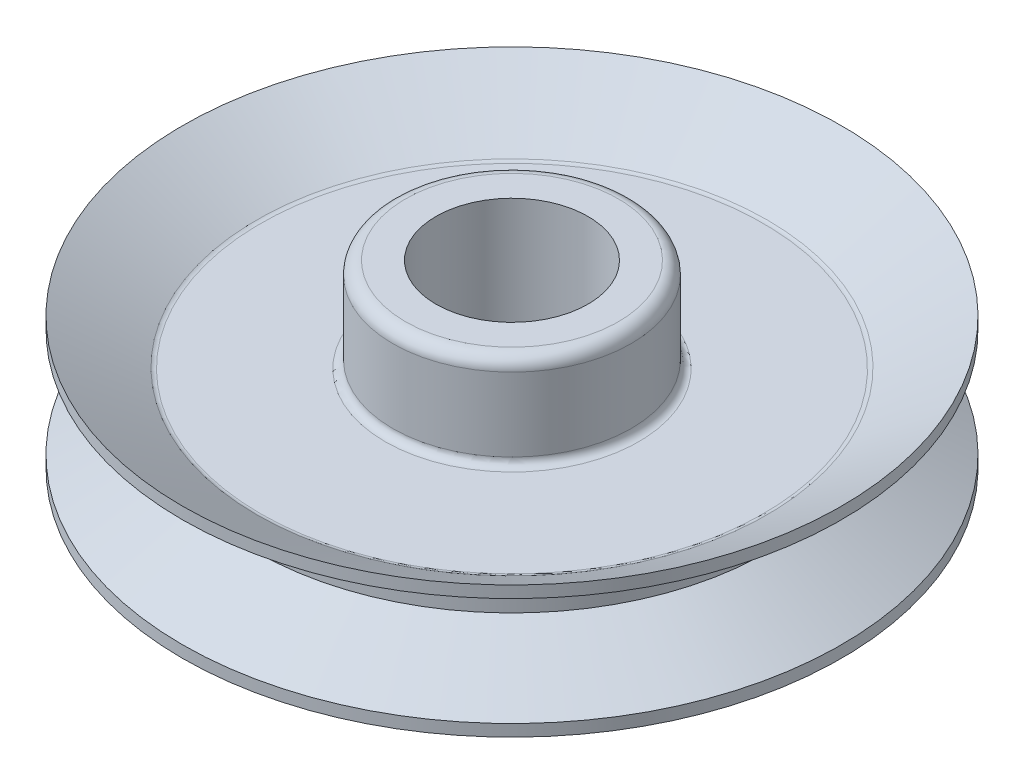
ISO-10303-21;
HEADER;
FILE_DESCRIPTION(('STEP AP214'),'2;1');
FILE_NAME('part.step','',(''),(''),'','','');
FILE_SCHEMA(('AUTOMOTIVE_DESIGN { 1 0 10303 214 1 1 1 1 }'));
ENDSEC;
DATA;
#1=APPLICATION_CONTEXT('core data for automotive mechanical design processes');
#2=APPLICATION_PROTOCOL_DEFINITION('international standard','automotive_design',2000,#1);
#3=PRODUCT_CONTEXT('',#1,'mechanical');
#4=PRODUCT('Part','Part','',(#3));
#5=PRODUCT_RELATED_PRODUCT_CATEGORY('part','',(#4));
#6=PRODUCT_DEFINITION_FORMATION('','',#4);
#7=PRODUCT_DEFINITION_CONTEXT('part definition',#1,'design');
#8=PRODUCT_DEFINITION('design','',#6,#7);
#9=PRODUCT_DEFINITION_SHAPE('','',#8);
#10=(LENGTH_UNIT() NAMED_UNIT(*) SI_UNIT(.MILLI.,.METRE.));
#11=(NAMED_UNIT(*) PLANE_ANGLE_UNIT() SI_UNIT($,.RADIAN.));
#12=(NAMED_UNIT(*) SI_UNIT($,.STERADIAN.) SOLID_ANGLE_UNIT());
#13=UNCERTAINTY_MEASURE_WITH_UNIT(LENGTH_MEASURE(1.E-05),#10,'distance_accuracy_value','');
#14=(GEOMETRIC_REPRESENTATION_CONTEXT(3) GLOBAL_UNCERTAINTY_ASSIGNED_CONTEXT((#13)) GLOBAL_UNIT_ASSIGNED_CONTEXT((#10,
#11,#12)) REPRESENTATION_CONTEXT('',''));
#15=CARTESIAN_POINT('',(0.,0.,0.));
#16=DIRECTION('',(0.,0.,1.));
#17=DIRECTION('',(1.,0.,0.));
#18=AXIS2_PLACEMENT_3D('',#15,#16,#17);
#19=CARTESIAN_POINT('',(0.,0.,0.));
#20=DIRECTION('',(0.,1.,0.));
#21=DIRECTION('',(0.,0.,1.));
#22=AXIS2_PLACEMENT_3D('',#19,#20,#21);
#23=CYLINDRICAL_SURFACE('',#22,13.);
#24=CARTESIAN_POINT('',(0.,2.38352384841238,0.));
#25=DIRECTION('',(0.,1.,0.));
#26=DIRECTION('',(0.,0.,1.));
#27=AXIS2_PLACEMENT_3D('',#24,#25,#26);
#28=CIRCLE('',#27,13.);
#29=CARTESIAN_POINT('',(0.,2.38352384841237,13.));
#30=VERTEX_POINT('',#29);
#31=EDGE_CURVE('E77',#30,#30,#28,.T.);
#32=ORIENTED_EDGE('',*,*,#31,.T.);
#33=EDGE_LOOP('',(#32));
#34=FACE_BOUND('',#33,.T.);
#35=CARTESIAN_POINT('',(0.,2.85,0.));
#36=DIRECTION('',(0.,1.,0.));
#37=DIRECTION('',(0.,0.,1.));
#38=AXIS2_PLACEMENT_3D('',#35,#36,#37);
#39=CIRCLE('',#38,13.);
#40=CARTESIAN_POINT('',(0.,2.85,13.));
#41=VERTEX_POINT('',#40);
#42=EDGE_CURVE('E92',#41,#41,#39,.T.);
#43=ORIENTED_EDGE('',*,*,#42,.F.);
#44=EDGE_LOOP('',(#43));
#45=FACE_BOUND('',#44,.T.);
#46=ADVANCED_FACE('F33',(#34,#45),#23,.T.);
#47=CARTESIAN_POINT('',(0.,2.38352384841238,0.));
#48=DIRECTION('',(0.,1.,0.));
#49=DIRECTION('',(0.,0.,1.));
#50=AXIS2_PLACEMENT_3D('',#47,#48,#49);
#51=CONICAL_SURFACE('',#50,13.,1.03037682652431);
#52=CARTESIAN_POINT('',(0.,0.650000000000002,0.));
#53=DIRECTION('',(0.,1.,0.));
#54=DIRECTION('',(0.,0.,1.));
#55=AXIS2_PLACEMENT_3D('',#52,#53,#54);
#56=CIRCLE('',#55,10.1107935859794);
#57=CARTESIAN_POINT('',(0.,0.650000000000001,10.1107935859794));
#58=VERTEX_POINT('',#57);
#59=EDGE_CURVE('E80',#58,#58,#56,.T.);
#60=ORIENTED_EDGE('',*,*,#59,.T.);
#61=EDGE_LOOP('',(#60));
#62=FACE_BOUND('',#61,.T.);
#63=ORIENTED_EDGE('',*,*,#31,.F.);
#64=EDGE_LOOP('',(#63));
#65=FACE_BOUND('',#64,.T.);
#66=ADVANCED_FACE('F119',(#62,#65),#51,.T.);
#67=CARTESIAN_POINT('',(0.,0.,0.));
#68=DIRECTION('',(0.,1.,0.));
#69=DIRECTION('',(0.,0.,1.));
#70=AXIS2_PLACEMENT_3D('',#67,#68,#69);
#71=CYLINDRICAL_SURFACE('',#70,10.1107935859794);
#72=CARTESIAN_POINT('',(0.,-0.150000000000004,0.));
#73=DIRECTION('',(0.,1.,0.));
#74=DIRECTION('',(0.,0.,1.));
#75=AXIS2_PLACEMENT_3D('',#72,#73,#74);
#76=CIRCLE('',#75,10.1107935859794);
#77=CARTESIAN_POINT('',(0.,-0.150000000000005,10.1107935859794));
#78=VERTEX_POINT('',#77);
#79=EDGE_CURVE('E83',#78,#78,#76,.T.);
#80=ORIENTED_EDGE('',*,*,#79,.T.);
#81=EDGE_LOOP('',(#80));
#82=FACE_BOUND('',#81,.T.);
#83=ORIENTED_EDGE('',*,*,#59,.F.);
#84=EDGE_LOOP('',(#83));
#85=FACE_BOUND('',#84,.T.);
#86=ADVANCED_FACE('F125',(#82,#85),#71,.T.);
#87=CARTESIAN_POINT('',(0.,-0.150000000000004,0.));
#88=DIRECTION('',(0.,-1.,0.));
#89=DIRECTION('',(0.,0.,-1.));
#90=AXIS2_PLACEMENT_3D('',#87,#88,#89);
#91=CONICAL_SURFACE('',#90,10.1107935859794,1.03037682652431);
#92=CARTESIAN_POINT('',(0.,-1.88352384841238,0.));
#93=DIRECTION('',(0.,1.,0.));
#94=DIRECTION('',(0.,0.,1.));
#95=AXIS2_PLACEMENT_3D('',#92,#93,#94);
#96=CIRCLE('',#95,13.);
#97=CARTESIAN_POINT('',(0.,-1.88352384841238,13.));
#98=VERTEX_POINT('',#97);
#99=EDGE_CURVE('E86',#98,#98,#96,.T.);
#100=ORIENTED_EDGE('',*,*,#99,.T.);
#101=EDGE_LOOP('',(#100));
#102=FACE_BOUND('',#101,.T.);
#103=ORIENTED_EDGE('',*,*,#79,.F.);
#104=EDGE_LOOP('',(#103));
#105=FACE_BOUND('',#104,.T.);
#106=ADVANCED_FACE('F176',(#102,#105),#91,.T.);
#107=CARTESIAN_POINT('',(0.,0.,0.));
#108=DIRECTION('',(0.,1.,0.));
#109=DIRECTION('',(0.,0.,1.));
#110=AXIS2_PLACEMENT_3D('',#107,#108,#109);
#111=CYLINDRICAL_SURFACE('',#110,13.);
#112=CARTESIAN_POINT('',(0.,-2.35,0.));
#113=DIRECTION('',(0.,1.,0.));
#114=DIRECTION('',(0.,0.,1.));
#115=AXIS2_PLACEMENT_3D('',#112,#113,#114);
#116=CIRCLE('',#115,13.);
#117=CARTESIAN_POINT('',(0.,-2.35,13.));
#118=VERTEX_POINT('',#117);
#119=EDGE_CURVE('E89',#118,#118,#116,.T.);
#120=ORIENTED_EDGE('',*,*,#119,.T.);
#121=EDGE_LOOP('',(#120));
#122=FACE_BOUND('',#121,.T.);
#123=ORIENTED_EDGE('',*,*,#99,.F.);
#124=EDGE_LOOP('',(#123));
#125=FACE_BOUND('',#124,.T.);
#126=ADVANCED_FACE('F169',(#122,#125),#111,.T.);
#127=CARTESIAN_POINT('',(0.,-2.35,0.));
#128=DIRECTION('',(0.,-1.,0.));
#129=DIRECTION('',(0.,0.,-1.));
#130=AXIS2_PLACEMENT_3D('',#127,#128,#129);
#131=CONICAL_SURFACE('',#130,13.,1.03037682652431);
#132=CARTESIAN_POINT('',(0.,-0.592752122286239,0.));
#133=DIRECTION('',(0.,-1.,0.));
#134=DIRECTION('',(0.,0.,-1.));
#135=AXIS2_PLACEMENT_3D('',#132,#133,#134);
#136=CIRCLE('',#135,10.0712535371437);
#137=CARTESIAN_POINT('',(0.,-0.592752122286237,-10.0712535371437));
#138=VERTEX_POINT('',#137);
#139=EDGE_CURVE('E62',#138,#138,#136,.F.);
#140=ORIENTED_EDGE('',*,*,#139,.T.);
#141=EDGE_LOOP('',(#140));
#142=FACE_BOUND('',#141,.T.);
#143=ORIENTED_EDGE('',*,*,#119,.F.);
#144=EDGE_LOOP('',(#143));
#145=FACE_BOUND('',#144,.T.);
#146=ADVANCED_FACE('F159',(#142,#145),#131,.F.);
#147=CARTESIAN_POINT('',(0.,-0.550000000000003,0.));
#148=DIRECTION('',(0.,-1.,0.));
#149=DIRECTION('',(0.,0.,-1.));
#150=AXIS2_PLACEMENT_3D('',#147,#148,#149);
#151=PLANE('',#150);
#152=CARTESIAN_POINT('',(0.,-0.550000000000003,0.));
#153=DIRECTION('',(0.,-1.,0.));
#154=DIRECTION('',(0.,0.,-1.));
#155=AXIS2_PLACEMENT_3D('',#152,#153,#154);
#156=CIRCLE('',#155,9.91690481051547);
#157=CARTESIAN_POINT('',(0.,-0.550000000000002,-9.91690481051547));
#158=VERTEX_POINT('',#157);
#159=EDGE_CURVE('E56',#158,#158,#156,.T.);
#160=ORIENTED_EDGE('',*,*,#159,.T.);
#161=EDGE_LOOP('',(#160));
#162=FACE_BOUND('',#161,.T.);
#163=CARTESIAN_POINT('',(0.,-0.550000000000003,0.));
#164=DIRECTION('',(0.,-1.,0.));
#165=DIRECTION('',(0.,0.,-1.));
#166=AXIS2_PLACEMENT_3D('',#163,#164,#165);
#167=CIRCLE('',#166,5.);
#168=CARTESIAN_POINT('',(0.,-0.550000000000003,-5.));
#169=VERTEX_POINT('',#168);
#170=EDGE_CURVE('E59',#169,#169,#167,.F.);
#171=ORIENTED_EDGE('',*,*,#170,.T.);
#172=EDGE_LOOP('',(#171));
#173=FACE_BOUND('',#172,.T.);
#174=ADVANCED_FACE('F156',(#162,#173),#151,.T.);
#175=CARTESIAN_POINT('',(0.,1.05,0.));
#176=DIRECTION('',(0.,1.,0.));
#177=DIRECTION('',(0.,0.,1.));
#178=AXIS2_PLACEMENT_3D('',#175,#176,#177);
#179=PLANE('',#178);
#180=CARTESIAN_POINT('',(0.,1.05,0.));
#181=DIRECTION('',(0.,1.,0.));
#182=DIRECTION('',(0.,0.,1.));
#183=AXIS2_PLACEMENT_3D('',#180,#181,#182);
#184=CIRCLE('',#183,9.91690481051547);
#185=CARTESIAN_POINT('',(0.,1.05,9.91690481051547));
#186=VERTEX_POINT('',#185);
#187=EDGE_CURVE('E48',#186,#186,#184,.T.);
#188=ORIENTED_EDGE('',*,*,#187,.T.);
#189=EDGE_LOOP('',(#188));
#190=FACE_BOUND('',#189,.T.);
#191=CARTESIAN_POINT('',(0.,1.05,0.));
#192=DIRECTION('',(0.,1.,0.));
#193=DIRECTION('',(0.,0.,1.));
#194=AXIS2_PLACEMENT_3D('',#191,#192,#193);
#195=CIRCLE('',#194,5.);
#196=CARTESIAN_POINT('',(0.,1.05,5.));
#197=VERTEX_POINT('',#196);
#198=EDGE_CURVE('E53',#197,#197,#195,.F.);
#199=ORIENTED_EDGE('',*,*,#198,.T.);
#200=EDGE_LOOP('',(#199));
#201=FACE_BOUND('',#200,.T.);
#202=ADVANCED_FACE('F158',(#190,#201),#179,.T.);
#203=CARTESIAN_POINT('',(0.,1.05,0.));
#204=DIRECTION('',(0.,1.,0.));
#205=DIRECTION('',(0.,0.,1.));
#206=AXIS2_PLACEMENT_3D('',#203,#204,#205);
#207=CONICAL_SURFACE('',#206,10.,1.03037682652431);
#208=CARTESIAN_POINT('',(0.,1.09275212228624,0.));
#209=DIRECTION('',(0.,1.,0.));
#210=DIRECTION('',(0.,0.,1.));
#211=AXIS2_PLACEMENT_3D('',#208,#209,#210);
#212=CIRCLE('',#211,10.0712535371437);
#213=CARTESIAN_POINT('',(0.,1.09275212228624,10.0712535371437));
#214=VERTEX_POINT('',#213);
#215=EDGE_CURVE('E44',#214,#214,#212,.F.);
#216=ORIENTED_EDGE('',*,*,#215,.T.);
#217=EDGE_LOOP('',(#216));
#218=FACE_BOUND('',#217,.T.);
#219=ORIENTED_EDGE('',*,*,#42,.T.);
#220=EDGE_LOOP('',(#219));
#221=FACE_BOUND('',#220,.T.);
#222=ADVANCED_FACE('F166',(#218,#221),#207,.F.);
#223=CARTESIAN_POINT('',(0.,4.75,0.));
#224=DIRECTION('',(0.,1.,0.));
#225=DIRECTION('',(0.,0.,1.));
#226=AXIS2_PLACEMENT_3D('',#223,#224,#225);
#227=PLANE('',#226);
#228=CARTESIAN_POINT('',(0.,4.75,0.));
#229=DIRECTION('',(0.,1.,0.));
#230=DIRECTION('',(0.,0.,1.));
#231=AXIS2_PLACEMENT_3D('',#228,#229,#230);
#232=CIRCLE('',#231,4.2);
#233=CARTESIAN_POINT('',(0.,4.75,4.2));
#234=VERTEX_POINT('',#233);
#235=EDGE_CURVE('E68',#234,#234,#232,.T.);
#236=ORIENTED_EDGE('',*,*,#235,.T.);
#237=EDGE_LOOP('',(#236));
#238=FACE_BOUND('',#237,.T.);
#239=CARTESIAN_POINT('',(0.,4.75,0.));
#240=DIRECTION('',(0.,1.,0.));
#241=DIRECTION('',(0.,0.,1.));
#242=AXIS2_PLACEMENT_3D('',#239,#240,#241);
#243=CIRCLE('',#242,3.);
#244=CARTESIAN_POINT('',(0.,4.75,3.));
#245=VERTEX_POINT('',#244);
#246=EDGE_CURVE('E95',#245,#245,#243,.T.);
#247=ORIENTED_EDGE('',*,*,#246,.F.);
#248=EDGE_LOOP('',(#247));
#249=FACE_BOUND('',#248,.T.);
#250=ADVANCED_FACE('F115',(#238,#249),#227,.T.);
#251=CARTESIAN_POINT('',(0.,4.75,0.));
#252=DIRECTION('',(0.,-1.,0.));
#253=DIRECTION('',(0.,0.,-1.));
#254=AXIS2_PLACEMENT_3D('',#251,#252,#253);
#255=CYLINDRICAL_SURFACE('',#254,4.7);
#256=CARTESIAN_POINT('',(0.,1.35,0.));
#257=DIRECTION('',(0.,1.,0.));
#258=DIRECTION('',(0.,0.,1.));
#259=AXIS2_PLACEMENT_3D('',#256,#257,#258);
#260=CIRCLE('',#259,4.7);
#261=CARTESIAN_POINT('',(0.,1.35,4.7));
#262=VERTEX_POINT('',#261);
#263=EDGE_CURVE('E10',#262,#262,#260,.T.);
#264=ORIENTED_EDGE('',*,*,#263,.T.);
#265=EDGE_LOOP('',(#264));
#266=FACE_BOUND('',#265,.T.);
#267=CARTESIAN_POINT('',(0.,4.25,0.));
#268=DIRECTION('',(0.,1.,0.));
#269=DIRECTION('',(0.,0.,1.));
#270=AXIS2_PLACEMENT_3D('',#267,#268,#269);
#271=CIRCLE('',#270,4.7);
#272=CARTESIAN_POINT('',(0.,4.25,4.7));
#273=VERTEX_POINT('',#272);
#274=EDGE_CURVE('E65',#273,#273,#271,.F.);
#275=ORIENTED_EDGE('',*,*,#274,.T.);
#276=EDGE_LOOP('',(#275));
#277=FACE_BOUND('',#276,.T.);
#278=ADVANCED_FACE('F107',(#266,#277),#255,.T.);
#279=CARTESIAN_POINT('',(0.,4.75,0.));
#280=DIRECTION('',(0.,-1.,0.));
#281=DIRECTION('',(0.,0.,-1.));
#282=AXIS2_PLACEMENT_3D('',#279,#280,#281);
#283=CYLINDRICAL_SURFACE('',#282,3.);
#284=ORIENTED_EDGE('',*,*,#246,.T.);
#285=EDGE_LOOP('',(#284));
#286=FACE_BOUND('',#285,.T.);
#287=CARTESIAN_POINT('',(0.,-4.25,0.));
#288=DIRECTION('',(0.,1.,0.));
#289=DIRECTION('',(0.,0.,1.));
#290=AXIS2_PLACEMENT_3D('',#287,#288,#289);
#291=CIRCLE('',#290,3.);
#292=CARTESIAN_POINT('',(0.,-4.25,3.));
#293=VERTEX_POINT('',#292);
#294=EDGE_CURVE('E98',#293,#293,#291,.T.);
#295=ORIENTED_EDGE('',*,*,#294,.F.);
#296=EDGE_LOOP('',(#295));
#297=FACE_BOUND('',#296,.T.);
#298=ADVANCED_FACE('F104',(#286,#297),#283,.F.);
#299=CARTESIAN_POINT('',(0.,-4.25,0.));
#300=DIRECTION('',(0.,1.,0.));
#301=DIRECTION('',(0.,0.,1.));
#302=AXIS2_PLACEMENT_3D('',#299,#300,#301);
#303=CYLINDRICAL_SURFACE('',#302,4.7);
#304=CARTESIAN_POINT('',(0.,-0.850000000000003,0.));
#305=DIRECTION('',(0.,-1.,0.));
#306=DIRECTION('',(0.,0.,-1.));
#307=AXIS2_PLACEMENT_3D('',#304,#305,#306);
#308=CIRCLE('',#307,4.7);
#309=CARTESIAN_POINT('',(0.,-0.850000000000003,-4.7));
#310=VERTEX_POINT('',#309);
#311=EDGE_CURVE('E40',#310,#310,#308,.T.);
#312=ORIENTED_EDGE('',*,*,#311,.T.);
#313=EDGE_LOOP('',(#312));
#314=FACE_BOUND('',#313,.T.);
#315=CARTESIAN_POINT('',(0.,-3.75,0.));
#316=DIRECTION('',(0.,-1.,0.));
#317=DIRECTION('',(0.,0.,-1.));
#318=AXIS2_PLACEMENT_3D('',#315,#316,#317);
#319=CIRCLE('',#318,4.7);
#320=CARTESIAN_POINT('',(0.,-3.75,-4.7));
#321=VERTEX_POINT('',#320);
#322=EDGE_CURVE('E74',#321,#321,#319,.F.);
#323=ORIENTED_EDGE('',*,*,#322,.T.);
#324=EDGE_LOOP('',(#323));
#325=FACE_BOUND('',#324,.T.);
#326=ADVANCED_FACE('F106',(#314,#325),#303,.T.);
#327=CARTESIAN_POINT('',(0.,-4.25,0.));
#328=DIRECTION('',(0.,-1.,0.));
#329=DIRECTION('',(0.,0.,1.));
#330=AXIS2_PLACEMENT_3D('',#327,#328,#329);
#331=PLANE('',#330);
#332=CARTESIAN_POINT('',(0.,-4.25,0.));
#333=DIRECTION('',(0.,-1.,0.));
#334=DIRECTION('',(0.,0.,-1.));
#335=AXIS2_PLACEMENT_3D('',#332,#333,#334);
#336=CIRCLE('',#335,4.2);
#337=CARTESIAN_POINT('',(0.,-4.25,-4.2));
#338=VERTEX_POINT('',#337);
#339=EDGE_CURVE('E71',#338,#338,#336,.T.);
#340=ORIENTED_EDGE('',*,*,#339,.T.);
#341=EDGE_LOOP('',(#340));
#342=FACE_BOUND('',#341,.T.);
#343=ORIENTED_EDGE('',*,*,#294,.T.);
#344=EDGE_LOOP('',(#343));
#345=FACE_BOUND('',#344,.T.);
#346=ADVANCED_FACE('F102',(#342,#345),#331,.T.);
#347=CARTESIAN_POINT('',(0.,-3.75,0.));
#348=DIRECTION('',(0.,-1.,0.));
#349=DIRECTION('',(0.,0.,-1.));
#350=AXIS2_PLACEMENT_3D('',#347,#348,#349);
#351=TOROIDAL_SURFACE('',#350,4.2,0.5);
#352=ORIENTED_EDGE('',*,*,#339,.F.);
#353=EDGE_LOOP('',(#352));
#354=FACE_BOUND('',#353,.T.);
#355=ORIENTED_EDGE('',*,*,#322,.F.);
#356=EDGE_LOOP('',(#355));
#357=FACE_BOUND('',#356,.T.);
#358=ADVANCED_FACE('F131',(#354,#357),#351,.T.);
#359=CARTESIAN_POINT('',(0.,4.25,0.));
#360=DIRECTION('',(0.,1.,0.));
#361=DIRECTION('',(0.,0.,1.));
#362=AXIS2_PLACEMENT_3D('',#359,#360,#361);
#363=TOROIDAL_SURFACE('',#362,4.2,0.5);
#364=ORIENTED_EDGE('',*,*,#274,.F.);
#365=EDGE_LOOP('',(#364));
#366=FACE_BOUND('',#365,.T.);
#367=ORIENTED_EDGE('',*,*,#235,.F.);
#368=EDGE_LOOP('',(#367));
#369=FACE_BOUND('',#368,.T.);
#370=ADVANCED_FACE('F134',(#366,#369),#363,.T.);
#371=CARTESIAN_POINT('',(0.,-0.850000000000003,0.));
#372=DIRECTION('',(0.,-1.,0.));
#373=DIRECTION('',(0.,0.,-1.));
#374=AXIS2_PLACEMENT_3D('',#371,#372,#373);
#375=TOROIDAL_SURFACE('',#374,9.91690481051547,0.3);
#376=ORIENTED_EDGE('',*,*,#159,.F.);
#377=EDGE_LOOP('',(#376));
#378=FACE_BOUND('',#377,.T.);
#379=ORIENTED_EDGE('',*,*,#139,.F.);
#380=EDGE_LOOP('',(#379));
#381=FACE_BOUND('',#380,.T.);
#382=ADVANCED_FACE('F138',(#378,#381),#375,.F.);
#383=CARTESIAN_POINT('',(0.,1.35,0.));
#384=DIRECTION('',(0.,1.,0.));
#385=DIRECTION('',(0.,0.,1.));
#386=AXIS2_PLACEMENT_3D('',#383,#384,#385);
#387=TOROIDAL_SURFACE('',#386,9.91690481051547,0.3);
#388=ORIENTED_EDGE('',*,*,#215,.F.);
#389=EDGE_LOOP('',(#388));
#390=FACE_BOUND('',#389,.T.);
#391=ORIENTED_EDGE('',*,*,#187,.F.);
#392=EDGE_LOOP('',(#391));
#393=FACE_BOUND('',#392,.T.);
#394=ADVANCED_FACE('F142',(#390,#393),#387,.F.);
#395=CARTESIAN_POINT('',(0.,-0.850000000000004,0.));
#396=DIRECTION('',(0.,-1.,0.));
#397=DIRECTION('',(0.,0.,-1.));
#398=AXIS2_PLACEMENT_3D('',#395,#396,#397);
#399=TOROIDAL_SURFACE('',#398,5.,0.3);
#400=ORIENTED_EDGE('',*,*,#170,.F.);
#401=EDGE_LOOP('',(#400));
#402=FACE_BOUND('',#401,.T.);
#403=ORIENTED_EDGE('',*,*,#311,.F.);
#404=EDGE_LOOP('',(#403));
#405=FACE_BOUND('',#404,.T.);
#406=ADVANCED_FACE('F145',(#402,#405),#399,.F.);
#407=CARTESIAN_POINT('',(0.,1.35,0.));
#408=DIRECTION('',(0.,1.,0.));
#409=DIRECTION('',(0.,0.,1.));
#410=AXIS2_PLACEMENT_3D('',#407,#408,#409);
#411=TOROIDAL_SURFACE('',#410,5.,0.3);
#412=ORIENTED_EDGE('',*,*,#198,.F.);
#413=EDGE_LOOP('',(#412));
#414=FACE_BOUND('',#413,.T.);
#415=ORIENTED_EDGE('',*,*,#263,.F.);
#416=EDGE_LOOP('',(#415));
#417=FACE_BOUND('',#416,.T.);
#418=ADVANCED_FACE('F35',(#414,#417),#411,.F.);
#419=CLOSED_SHELL('',(#46,#66,#86,#106,#126,#146,#174,#202,#222,#250,#278,#298,#326,#346,#358,
#370,#382,#394,#406,#418));
#420=MANIFOLD_SOLID_BREP('B2',#419);
#421=ADVANCED_BREP_SHAPE_REPRESENTATION('',(#18,#420),#14);
#422=SHAPE_DEFINITION_REPRESENTATION(#9,#421);
ENDSEC;
END-ISO-10303-21;
